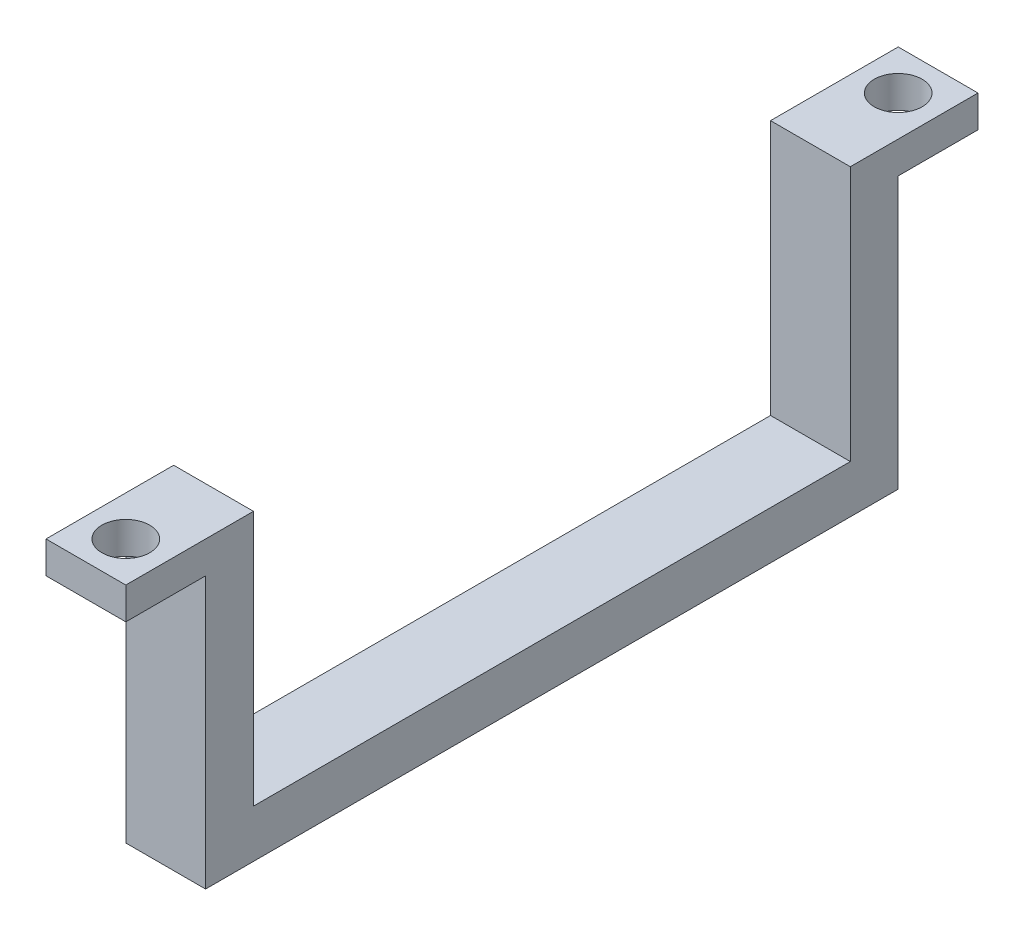
ISO-10303-21;
HEADER;
FILE_DESCRIPTION(('STEP AP214'),'2;1');
FILE_NAME('part.step','',(''),(''),'','','');
FILE_SCHEMA(('AUTOMOTIVE_DESIGN { 1 0 10303 214 1 1 1 1 }'));
ENDSEC;
DATA;
#1=APPLICATION_CONTEXT('core data for automotive mechanical design processes');
#2=APPLICATION_PROTOCOL_DEFINITION('international standard','automotive_design',2000,#1);
#3=PRODUCT_CONTEXT('',#1,'mechanical');
#4=PRODUCT('Part','Part','',(#3));
#5=PRODUCT_RELATED_PRODUCT_CATEGORY('part','',(#4));
#6=PRODUCT_DEFINITION_FORMATION('','',#4);
#7=PRODUCT_DEFINITION_CONTEXT('part definition',#1,'design');
#8=PRODUCT_DEFINITION('design','',#6,#7);
#9=PRODUCT_DEFINITION_SHAPE('','',#8);
#10=(LENGTH_UNIT() NAMED_UNIT(*) SI_UNIT(.MILLI.,.METRE.));
#11=(NAMED_UNIT(*) PLANE_ANGLE_UNIT() SI_UNIT($,.RADIAN.));
#12=(NAMED_UNIT(*) SI_UNIT($,.STERADIAN.) SOLID_ANGLE_UNIT());
#13=UNCERTAINTY_MEASURE_WITH_UNIT(LENGTH_MEASURE(1.E-05),#10,'distance_accuracy_value','');
#14=(GEOMETRIC_REPRESENTATION_CONTEXT(3) GLOBAL_UNCERTAINTY_ASSIGNED_CONTEXT((#13)) GLOBAL_UNIT_ASSIGNED_CONTEXT((#10,
#11,#12)) REPRESENTATION_CONTEXT('',''));
#15=CARTESIAN_POINT('',(0.,0.,0.));
#16=DIRECTION('',(0.,0.,1.));
#17=DIRECTION('',(1.,0.,0.));
#18=AXIS2_PLACEMENT_3D('',#15,#16,#17);
#19=CARTESIAN_POINT('',(0.,2.,0.));
#20=DIRECTION('',(0.,1.,0.));
#21=DIRECTION('',(0.,0.,1.));
#22=AXIS2_PLACEMENT_3D('',#19,#20,#21);
#23=PLANE('',#22);
#24=DIRECTION('',(0.,0.,1.));
#25=VECTOR('',#24,1.);
#26=CARTESIAN_POINT('',(0.,2.,0.));
#27=LINE('',#26,#25);
#28=CARTESIAN_POINT('',(0.,2.,0.));
#29=VERTEX_POINT('',#28);
#30=CARTESIAN_POINT('',(0.,2.,8.));
#31=VERTEX_POINT('',#30);
#32=EDGE_CURVE('E207',#29,#31,#27,.T.);
#33=ORIENTED_EDGE('',*,*,#32,.T.);
#34=DIRECTION('',(1.,0.,0.));
#35=VECTOR('',#34,1.);
#36=CARTESIAN_POINT('',(0.,2.,8.));
#37=LINE('',#36,#35);
#38=CARTESIAN_POINT('',(5.,2.,8.));
#39=VERTEX_POINT('',#38);
#40=EDGE_CURVE('E209',#31,#39,#37,.T.);
#41=ORIENTED_EDGE('',*,*,#40,.T.);
#42=DIRECTION('',(0.,0.,1.));
#43=VECTOR('',#42,1.);
#44=CARTESIAN_POINT('',(5.,2.,0.));
#45=LINE('',#44,#43);
#46=CARTESIAN_POINT('',(5.,2.,0.));
#47=VERTEX_POINT('',#46);
#48=EDGE_CURVE('E213',#47,#39,#45,.T.);
#49=ORIENTED_EDGE('',*,*,#48,.F.);
#50=DIRECTION('',(1.,0.,0.));
#51=VECTOR('',#50,1.);
#52=CARTESIAN_POINT('',(0.,2.,0.));
#53=LINE('',#52,#51);
#54=EDGE_CURVE('E215',#29,#47,#53,.T.);
#55=ORIENTED_EDGE('',*,*,#54,.F.);
#56=EDGE_LOOP('',(#33,#41,#49,#55));
#57=FACE_BOUND('',#56,.T.);
#58=CARTESIAN_POINT('',(2.50000000000001,2.,2.5));
#59=DIRECTION('',(0.,1.,0.));
#60=DIRECTION('',(0.,0.,1.));
#61=AXIS2_PLACEMENT_3D('',#58,#59,#60);
#62=CIRCLE('',#61,1.5);
#63=CARTESIAN_POINT('',(2.50000000000001,2.,4.));
#64=VERTEX_POINT('',#63);
#65=EDGE_CURVE('E201',#64,#64,#62,.T.);
#66=ORIENTED_EDGE('',*,*,#65,.F.);
#67=EDGE_LOOP('',(#66));
#68=FACE_BOUND('',#67,.T.);
#69=ADVANCED_FACE('F65',(#57,#68),#23,.T.);
#70=CARTESIAN_POINT('',(0.,0.,0.));
#71=DIRECTION('',(0.,1.,0.));
#72=DIRECTION('',(0.,0.,1.));
#73=AXIS2_PLACEMENT_3D('',#70,#71,#72);
#74=PLANE('',#73);
#75=DIRECTION('',(0.,0.,1.));
#76=VECTOR('',#75,1.);
#77=CARTESIAN_POINT('',(5.,0.,0.));
#78=LINE('',#77,#76);
#79=CARTESIAN_POINT('',(5.,0.,0.));
#80=VERTEX_POINT('',#79);
#81=CARTESIAN_POINT('',(5.,0.,5.00000000000018));
#82=VERTEX_POINT('',#81);
#83=EDGE_CURVE('E85',#80,#82,#78,.T.);
#84=ORIENTED_EDGE('',*,*,#83,.T.);
#85=DIRECTION('',(-1.,0.,0.));
#86=VECTOR('',#85,1.);
#87=CARTESIAN_POINT('',(0.,0.,5.00000000000018));
#88=LINE('',#87,#86);
#89=CARTESIAN_POINT('',(0.,0.,5.00000000000018));
#90=VERTEX_POINT('',#89);
#91=EDGE_CURVE('E80',#82,#90,#88,.T.);
#92=ORIENTED_EDGE('',*,*,#91,.T.);
#93=DIRECTION('',(0.,0.,1.));
#94=VECTOR('',#93,1.);
#95=CARTESIAN_POINT('',(0.,0.,0.));
#96=LINE('',#95,#94);
#97=CARTESIAN_POINT('',(0.,0.,0.));
#98=VERTEX_POINT('',#97);
#99=EDGE_CURVE('E204',#98,#90,#96,.T.);
#100=ORIENTED_EDGE('',*,*,#99,.F.);
#101=DIRECTION('',(1.,0.,0.));
#102=VECTOR('',#101,1.);
#103=CARTESIAN_POINT('',(0.,0.,0.));
#104=LINE('',#103,#102);
#105=EDGE_CURVE('E210',#98,#80,#104,.T.);
#106=ORIENTED_EDGE('',*,*,#105,.T.);
#107=EDGE_LOOP('',(#84,#92,#100,#106));
#108=FACE_BOUND('',#107,.T.);
#109=CARTESIAN_POINT('',(2.50000000000001,0.,2.5));
#110=DIRECTION('',(0.,1.,0.));
#111=DIRECTION('',(0.,0.,1.));
#112=AXIS2_PLACEMENT_3D('',#109,#110,#111);
#113=CIRCLE('',#112,1.5);
#114=CARTESIAN_POINT('',(2.50000000000001,0.,4.));
#115=VERTEX_POINT('',#114);
#116=EDGE_CURVE('E200',#115,#115,#113,.T.);
#117=ORIENTED_EDGE('',*,*,#116,.T.);
#118=EDGE_LOOP('',(#117));
#119=FACE_BOUND('',#118,.T.);
#120=ADVANCED_FACE('F238',(#108,#119),#74,.F.);
#121=CARTESIAN_POINT('',(0.,2.,0.));
#122=DIRECTION('',(1.,0.,0.));
#123=DIRECTION('',(0.,0.,-1.));
#124=AXIS2_PLACEMENT_3D('',#121,#122,#123);
#125=PLANE('',#124);
#126=ORIENTED_EDGE('',*,*,#99,.T.);
#127=DIRECTION('',(0.,1.,0.));
#128=VECTOR('',#127,1.);
#129=CARTESIAN_POINT('',(0.,-14.,5.00000000000018));
#130=LINE('',#129,#128);
#131=CARTESIAN_POINT('',(0.,-17.,5.00000000000018));
#132=VERTEX_POINT('',#131);
#133=EDGE_CURVE('E196',#132,#90,#130,.T.);
#134=ORIENTED_EDGE('',*,*,#133,.F.);
#135=DIRECTION('',(0.,0.,1.));
#136=VECTOR('',#135,1.);
#137=CARTESIAN_POINT('',(0.,-17.,-0.830951894845125));
#138=LINE('',#137,#136);
#139=CARTESIAN_POINT('',(0.,-17.,48.4));
#140=VERTEX_POINT('',#139);
#141=EDGE_CURVE('E179',#132,#140,#138,.T.);
#142=ORIENTED_EDGE('',*,*,#141,.T.);
#143=DIRECTION('',(0.,-1.,0.));
#144=VECTOR('',#143,1.);
#145=CARTESIAN_POINT('',(0.,-14.,48.4));
#146=LINE('',#145,#144);
#147=CARTESIAN_POINT('',(0.,0.,48.4));
#148=VERTEX_POINT('',#147);
#149=EDGE_CURVE('E185',#148,#140,#146,.T.);
#150=ORIENTED_EDGE('',*,*,#149,.F.);
#151=DIRECTION('',(0.,0.,-1.));
#152=VECTOR('',#151,1.);
#153=CARTESIAN_POINT('',(0.,0.,53.4));
#154=LINE('',#153,#152);
#155=CARTESIAN_POINT('',(0.,0.,53.4));
#156=VERTEX_POINT('',#155);
#157=EDGE_CURVE('E269',#156,#148,#154,.T.);
#158=ORIENTED_EDGE('',*,*,#157,.F.);
#159=DIRECTION('',(0.,-1.,0.));
#160=VECTOR('',#159,1.);
#161=CARTESIAN_POINT('',(0.,2.,53.4));
#162=LINE('',#161,#160);
#163=CARTESIAN_POINT('',(0.,2.,53.4));
#164=VERTEX_POINT('',#163);
#165=EDGE_CURVE('E163',#164,#156,#162,.T.);
#166=ORIENTED_EDGE('',*,*,#165,.F.);
#167=DIRECTION('',(0.,0.,-1.));
#168=VECTOR('',#167,1.);
#169=CARTESIAN_POINT('',(0.,2.,53.4));
#170=LINE('',#169,#168);
#171=CARTESIAN_POINT('',(0.,2.,45.4));
#172=VERTEX_POINT('',#171);
#173=EDGE_CURVE('E159',#164,#172,#170,.T.);
#174=ORIENTED_EDGE('',*,*,#173,.T.);
#175=DIRECTION('',(0.,-1.,0.));
#176=VECTOR('',#175,1.);
#177=CARTESIAN_POINT('',(0.,2.,45.4));
#178=LINE('',#177,#176);
#179=CARTESIAN_POINT('',(0.,-14.,45.4));
#180=VERTEX_POINT('',#179);
#181=EDGE_CURVE('E153',#172,#180,#178,.T.);
#182=ORIENTED_EDGE('',*,*,#181,.T.);
#183=DIRECTION('',(0.,0.,1.));
#184=VECTOR('',#183,1.);
#185=CARTESIAN_POINT('',(0.,-14.,-0.830951894845125));
#186=LINE('',#185,#184);
#187=CARTESIAN_POINT('',(0.,-14.,8.00000000000018));
#188=VERTEX_POINT('',#187);
#189=EDGE_CURVE('E157',#188,#180,#186,.T.);
#190=ORIENTED_EDGE('',*,*,#189,.F.);
#191=DIRECTION('',(0.,-1.,0.));
#192=VECTOR('',#191,1.);
#193=CARTESIAN_POINT('',(0.,2.,8.));
#194=LINE('',#193,#192);
#195=EDGE_CURVE('E12',#31,#188,#194,.T.);
#196=ORIENTED_EDGE('',*,*,#195,.F.);
#197=ORIENTED_EDGE('',*,*,#32,.F.);
#198=DIRECTION('',(0.,-1.,0.));
#199=VECTOR('',#198,1.);
#200=CARTESIAN_POINT('',(0.,2.,0.));
#201=LINE('',#200,#199);
#202=EDGE_CURVE('E218',#29,#98,#201,.T.);
#203=ORIENTED_EDGE('',*,*,#202,.T.);
#204=EDGE_LOOP('',(#126,#134,#142,#150,#158,#166,#174,#182,#190,#196,#197,#203));
#205=FACE_BOUND('',#204,.T.);
#206=ADVANCED_FACE('F67',(#205),#125,.F.);
#207=CARTESIAN_POINT('',(0.,2.,8.));
#208=DIRECTION('',(0.,0.,-1.));
#209=DIRECTION('',(-1.,0.,0.));
#210=AXIS2_PLACEMENT_3D('',#207,#208,#209);
#211=PLANE('',#210);
#212=ORIENTED_EDGE('',*,*,#195,.T.);
#213=DIRECTION('',(-1.,0.,0.));
#214=VECTOR('',#213,1.);
#215=CARTESIAN_POINT('',(0.,-14.,8.00000000000018));
#216=LINE('',#215,#214);
#217=CARTESIAN_POINT('',(5.00000000000001,-14.,8.00000000000018));
#218=VERTEX_POINT('',#217);
#219=EDGE_CURVE('E178',#218,#188,#216,.T.);
#220=ORIENTED_EDGE('',*,*,#219,.F.);
#221=DIRECTION('',(0.,-1.,0.));
#222=VECTOR('',#221,1.);
#223=CARTESIAN_POINT('',(5.,2.,8.));
#224=LINE('',#223,#222);
#225=EDGE_CURVE('E73',#39,#218,#224,.T.);
#226=ORIENTED_EDGE('',*,*,#225,.F.);
#227=ORIENTED_EDGE('',*,*,#40,.F.);
#228=EDGE_LOOP('',(#212,#220,#226,#227));
#229=FACE_BOUND('',#228,.T.);
#230=ADVANCED_FACE('F230',(#229),#211,.F.);
#231=CARTESIAN_POINT('',(5.,2.,0.));
#232=DIRECTION('',(1.,0.,0.));
#233=DIRECTION('',(0.,0.,-1.));
#234=AXIS2_PLACEMENT_3D('',#231,#232,#233);
#235=PLANE('',#234);
#236=ORIENTED_EDGE('',*,*,#48,.T.);
#237=ORIENTED_EDGE('',*,*,#225,.T.);
#238=DIRECTION('',(0.,0.,1.));
#239=VECTOR('',#238,1.);
#240=CARTESIAN_POINT('',(5.00000000000002,-14.,-0.830951894845125));
#241=LINE('',#240,#239);
#242=CARTESIAN_POINT('',(5.00000000000001,-14.,45.4));
#243=VERTEX_POINT('',#242);
#244=EDGE_CURVE('E189',#218,#243,#241,.T.);
#245=ORIENTED_EDGE('',*,*,#244,.T.);
#246=DIRECTION('',(0.,-1.,0.));
#247=VECTOR('',#246,1.);
#248=CARTESIAN_POINT('',(5.00000000000001,2.,45.4));
#249=LINE('',#248,#247);
#250=CARTESIAN_POINT('',(5.00000000000001,2.,45.4));
#251=VERTEX_POINT('',#250);
#252=EDGE_CURVE('E164',#251,#243,#249,.T.);
#253=ORIENTED_EDGE('',*,*,#252,.F.);
#254=DIRECTION('',(0.,0.,-1.));
#255=VECTOR('',#254,1.);
#256=CARTESIAN_POINT('',(5.00000000000001,2.,53.4));
#257=LINE('',#256,#255);
#258=CARTESIAN_POINT('',(5.00000000000001,2.,53.4));
#259=VERTEX_POINT('',#258);
#260=EDGE_CURVE('E286',#259,#251,#257,.T.);
#261=ORIENTED_EDGE('',*,*,#260,.F.);
#262=DIRECTION('',(0.,-1.,0.));
#263=VECTOR('',#262,1.);
#264=CARTESIAN_POINT('',(5.00000000000001,2.,53.4));
#265=LINE('',#264,#263);
#266=CARTESIAN_POINT('',(5.00000000000001,0.,53.4));
#267=VERTEX_POINT('',#266);
#268=EDGE_CURVE('E270',#259,#267,#265,.T.);
#269=ORIENTED_EDGE('',*,*,#268,.T.);
#270=DIRECTION('',(0.,0.,-1.));
#271=VECTOR('',#270,1.);
#272=CARTESIAN_POINT('',(5.00000000000001,0.,53.4));
#273=LINE('',#272,#271);
#274=CARTESIAN_POINT('',(5.00000000000001,0.,48.4));
#275=VERTEX_POINT('',#274);
#276=EDGE_CURVE('E265',#267,#275,#273,.T.);
#277=ORIENTED_EDGE('',*,*,#276,.T.);
#278=DIRECTION('',(0.,1.,0.));
#279=VECTOR('',#278,1.);
#280=CARTESIAN_POINT('',(5.00000000000002,-14.,48.4));
#281=LINE('',#280,#279);
#282=CARTESIAN_POINT('',(5.00000000000002,-17.,48.4));
#283=VERTEX_POINT('',#282);
#284=EDGE_CURVE('E257',#283,#275,#281,.T.);
#285=ORIENTED_EDGE('',*,*,#284,.F.);
#286=DIRECTION('',(0.,0.,1.));
#287=VECTOR('',#286,1.);
#288=CARTESIAN_POINT('',(5.00000000000002,-17.,-0.830951894845125));
#289=LINE('',#288,#287);
#290=CARTESIAN_POINT('',(5.00000000000002,-17.,5.00000000000018));
#291=VERTEX_POINT('',#290);
#292=EDGE_CURVE('E191',#291,#283,#289,.T.);
#293=ORIENTED_EDGE('',*,*,#292,.F.);
#294=DIRECTION('',(0.,1.,0.));
#295=VECTOR('',#294,1.);
#296=CARTESIAN_POINT('',(5.00000000000001,-14.,5.00000000000018));
#297=LINE('',#296,#295);
#298=EDGE_CURVE('E193',#291,#82,#297,.T.);
#299=ORIENTED_EDGE('',*,*,#298,.T.);
#300=ORIENTED_EDGE('',*,*,#83,.F.);
#301=DIRECTION('',(0.,-1.,0.));
#302=VECTOR('',#301,1.);
#303=CARTESIAN_POINT('',(5.,2.,0.));
#304=LINE('',#303,#302);
#305=EDGE_CURVE('E223',#47,#80,#304,.T.);
#306=ORIENTED_EDGE('',*,*,#305,.F.);
#307=EDGE_LOOP('',(#236,#237,#245,#253,#261,#269,#277,#285,#293,#299,#300,#306));
#308=FACE_BOUND('',#307,.T.);
#309=ADVANCED_FACE('F226',(#308),#235,.T.);
#310=CARTESIAN_POINT('',(0.,2.,0.));
#311=DIRECTION('',(0.,0.,-1.));
#312=DIRECTION('',(-1.,0.,0.));
#313=AXIS2_PLACEMENT_3D('',#310,#311,#312);
#314=PLANE('',#313);
#315=ORIENTED_EDGE('',*,*,#105,.F.);
#316=ORIENTED_EDGE('',*,*,#202,.F.);
#317=ORIENTED_EDGE('',*,*,#54,.T.);
#318=ORIENTED_EDGE('',*,*,#305,.T.);
#319=EDGE_LOOP('',(#315,#316,#317,#318));
#320=FACE_BOUND('',#319,.T.);
#321=ADVANCED_FACE('F237',(#320),#314,.T.);
#322=CARTESIAN_POINT('',(2.50000000000001,2.,2.5));
#323=DIRECTION('',(0.,-1.,0.));
#324=DIRECTION('',(0.,0.,-1.));
#325=AXIS2_PLACEMENT_3D('',#322,#323,#324);
#326=CYLINDRICAL_SURFACE('',#325,1.5);
#327=ORIENTED_EDGE('',*,*,#65,.T.);
#328=EDGE_LOOP('',(#327));
#329=FACE_BOUND('',#328,.T.);
#330=ORIENTED_EDGE('',*,*,#116,.F.);
#331=EDGE_LOOP('',(#330));
#332=FACE_BOUND('',#331,.T.);
#333=ADVANCED_FACE('F318',(#329,#332),#326,.F.);
#334=CARTESIAN_POINT('',(0.,-14.,5.00000000000018));
#335=DIRECTION('',(0.,0.,-1.));
#336=DIRECTION('',(-1.,0.,0.));
#337=AXIS2_PLACEMENT_3D('',#334,#335,#336);
#338=PLANE('',#337);
#339=ORIENTED_EDGE('',*,*,#91,.F.);
#340=ORIENTED_EDGE('',*,*,#298,.F.);
#341=DIRECTION('',(1.,0.,0.));
#342=VECTOR('',#341,1.);
#343=CARTESIAN_POINT('',(5.00000000000002,-17.,5.00000000000018));
#344=LINE('',#343,#342);
#345=EDGE_CURVE('E182',#132,#291,#344,.T.);
#346=ORIENTED_EDGE('',*,*,#345,.F.);
#347=ORIENTED_EDGE('',*,*,#133,.T.);
#348=EDGE_LOOP('',(#339,#340,#346,#347));
#349=FACE_BOUND('',#348,.T.);
#350=ADVANCED_FACE('F242',(#349),#338,.T.);
#351=CARTESIAN_POINT('',(0.,0.,48.4));
#352=DIRECTION('',(0.,0.,-1.));
#353=DIRECTION('',(-1.,0.,0.));
#354=AXIS2_PLACEMENT_3D('',#351,#352,#353);
#355=PLANE('',#354);
#356=ORIENTED_EDGE('',*,*,#284,.T.);
#357=DIRECTION('',(-1.,0.,0.));
#358=VECTOR('',#357,1.);
#359=CARTESIAN_POINT('',(0.,0.,48.4));
#360=LINE('',#359,#358);
#361=EDGE_CURVE('E173',#275,#148,#360,.T.);
#362=ORIENTED_EDGE('',*,*,#361,.T.);
#363=ORIENTED_EDGE('',*,*,#149,.T.);
#364=DIRECTION('',(1.,0.,0.));
#365=VECTOR('',#364,1.);
#366=CARTESIAN_POINT('',(5.00000000000002,-17.,48.4));
#367=LINE('',#366,#365);
#368=EDGE_CURVE('E180',#140,#283,#367,.T.);
#369=ORIENTED_EDGE('',*,*,#368,.T.);
#370=EDGE_LOOP('',(#356,#362,#363,#369));
#371=FACE_BOUND('',#370,.T.);
#372=ADVANCED_FACE('F255',(#371),#355,.F.);
#373=CARTESIAN_POINT('',(5.00000000000002,-14.,-0.830951894845125));
#374=DIRECTION('',(0.,1.,0.));
#375=DIRECTION('',(0.,0.,1.));
#376=AXIS2_PLACEMENT_3D('',#373,#374,#375);
#377=PLANE('',#376);
#378=DIRECTION('',(-1.,0.,0.));
#379=VECTOR('',#378,1.);
#380=CARTESIAN_POINT('',(0.,-14.,45.4));
#381=LINE('',#380,#379);
#382=EDGE_CURVE('E167',#243,#180,#381,.T.);
#383=ORIENTED_EDGE('',*,*,#382,.F.);
#384=ORIENTED_EDGE('',*,*,#244,.F.);
#385=ORIENTED_EDGE('',*,*,#219,.T.);
#386=ORIENTED_EDGE('',*,*,#189,.T.);
#387=EDGE_LOOP('',(#383,#384,#385,#386));
#388=FACE_BOUND('',#387,.T.);
#389=ADVANCED_FACE('F176',(#388),#377,.T.);
#390=CARTESIAN_POINT('',(5.00000000000002,-17.,-0.830951894845125));
#391=DIRECTION('',(0.,-1.,0.));
#392=DIRECTION('',(0.,0.,-1.));
#393=AXIS2_PLACEMENT_3D('',#390,#391,#392);
#394=PLANE('',#393);
#395=ORIENTED_EDGE('',*,*,#141,.F.);
#396=ORIENTED_EDGE('',*,*,#345,.T.);
#397=ORIENTED_EDGE('',*,*,#292,.T.);
#398=ORIENTED_EDGE('',*,*,#368,.F.);
#399=EDGE_LOOP('',(#395,#396,#397,#398));
#400=FACE_BOUND('',#399,.T.);
#401=ADVANCED_FACE('F249',(#400),#394,.T.);
#402=CARTESIAN_POINT('',(0.,0.,0.));
#403=DIRECTION('',(0.,1.,0.));
#404=DIRECTION('',(0.,0.,1.));
#405=AXIS2_PLACEMENT_3D('',#402,#403,#404);
#406=PLANE('',#405);
#407=CARTESIAN_POINT('',(2.50000000000001,0.,50.9));
#408=DIRECTION('',(0.,1.,0.));
#409=DIRECTION('',(0.,0.,1.));
#410=AXIS2_PLACEMENT_3D('',#407,#408,#409);
#411=CIRCLE('',#410,1.5);
#412=CARTESIAN_POINT('',(2.50000000000001,0.,52.4));
#413=VERTEX_POINT('',#412);
#414=EDGE_CURVE('E259',#413,#413,#411,.T.);
#415=ORIENTED_EDGE('',*,*,#414,.T.);
#416=EDGE_LOOP('',(#415));
#417=FACE_BOUND('',#416,.T.);
#418=ORIENTED_EDGE('',*,*,#361,.F.);
#419=ORIENTED_EDGE('',*,*,#276,.F.);
#420=DIRECTION('',(1.,0.,0.));
#421=VECTOR('',#420,1.);
#422=CARTESIAN_POINT('',(0.,0.,53.4));
#423=LINE('',#422,#421);
#424=EDGE_CURVE('E279',#156,#267,#423,.T.);
#425=ORIENTED_EDGE('',*,*,#424,.F.);
#426=ORIENTED_EDGE('',*,*,#157,.T.);
#427=EDGE_LOOP('',(#418,#419,#425,#426));
#428=FACE_BOUND('',#427,.T.);
#429=ADVANCED_FACE('F267',(#417,#428),#406,.F.);
#430=CARTESIAN_POINT('',(0.,2.,0.));
#431=DIRECTION('',(0.,1.,0.));
#432=DIRECTION('',(0.,0.,1.));
#433=AXIS2_PLACEMENT_3D('',#430,#431,#432);
#434=PLANE('',#433);
#435=DIRECTION('',(1.,0.,0.));
#436=VECTOR('',#435,1.);
#437=CARTESIAN_POINT('',(0.,2.,45.4));
#438=LINE('',#437,#436);
#439=EDGE_CURVE('E284',#172,#251,#438,.T.);
#440=ORIENTED_EDGE('',*,*,#439,.F.);
#441=ORIENTED_EDGE('',*,*,#173,.F.);
#442=DIRECTION('',(1.,0.,0.));
#443=VECTOR('',#442,1.);
#444=CARTESIAN_POINT('',(0.,2.,53.4));
#445=LINE('',#444,#443);
#446=EDGE_CURVE('E277',#164,#259,#445,.T.);
#447=ORIENTED_EDGE('',*,*,#446,.T.);
#448=ORIENTED_EDGE('',*,*,#260,.T.);
#449=EDGE_LOOP('',(#440,#441,#447,#448));
#450=FACE_BOUND('',#449,.T.);
#451=CARTESIAN_POINT('',(2.50000000000001,2.,50.9));
#452=DIRECTION('',(0.,1.,0.));
#453=DIRECTION('',(0.,0.,1.));
#454=AXIS2_PLACEMENT_3D('',#451,#452,#453);
#455=CIRCLE('',#454,1.5);
#456=CARTESIAN_POINT('',(2.50000000000001,2.,52.4));
#457=VERTEX_POINT('',#456);
#458=EDGE_CURVE('E282',#457,#457,#455,.T.);
#459=ORIENTED_EDGE('',*,*,#458,.F.);
#460=EDGE_LOOP('',(#459));
#461=FACE_BOUND('',#460,.T.);
#462=ADVANCED_FACE('F297',(#450,#461),#434,.T.);
#463=CARTESIAN_POINT('',(0.,2.,53.4));
#464=DIRECTION('',(0.,0.,-1.));
#465=DIRECTION('',(-1.,0.,0.));
#466=AXIS2_PLACEMENT_3D('',#463,#464,#465);
#467=PLANE('',#466);
#468=ORIENTED_EDGE('',*,*,#424,.T.);
#469=ORIENTED_EDGE('',*,*,#268,.F.);
#470=ORIENTED_EDGE('',*,*,#446,.F.);
#471=ORIENTED_EDGE('',*,*,#165,.T.);
#472=EDGE_LOOP('',(#468,#469,#470,#471));
#473=FACE_BOUND('',#472,.T.);
#474=ADVANCED_FACE('F299',(#473),#467,.F.);
#475=CARTESIAN_POINT('',(0.,2.,45.4));
#476=DIRECTION('',(0.,0.,-1.));
#477=DIRECTION('',(-1.,0.,0.));
#478=AXIS2_PLACEMENT_3D('',#475,#476,#477);
#479=PLANE('',#478);
#480=ORIENTED_EDGE('',*,*,#252,.T.);
#481=ORIENTED_EDGE('',*,*,#382,.T.);
#482=ORIENTED_EDGE('',*,*,#181,.F.);
#483=ORIENTED_EDGE('',*,*,#439,.T.);
#484=EDGE_LOOP('',(#480,#481,#482,#483));
#485=FACE_BOUND('',#484,.T.);
#486=ADVANCED_FACE('F168',(#485),#479,.T.);
#487=CARTESIAN_POINT('',(2.50000000000001,2.,50.9));
#488=DIRECTION('',(0.,-1.,0.));
#489=DIRECTION('',(0.,0.,-1.));
#490=AXIS2_PLACEMENT_3D('',#487,#488,#489);
#491=CYLINDRICAL_SURFACE('',#490,1.5);
#492=ORIENTED_EDGE('',*,*,#458,.T.);
#493=EDGE_LOOP('',(#492));
#494=FACE_BOUND('',#493,.T.);
#495=ORIENTED_EDGE('',*,*,#414,.F.);
#496=EDGE_LOOP('',(#495));
#497=FACE_BOUND('',#496,.T.);
#498=ADVANCED_FACE('F294',(#494,#497),#491,.F.);
#499=CLOSED_SHELL('',(#69,#120,#206,#230,#309,#321,#333,#350,#372,#389,#401,#429,#462,#474,#486,#498));
#500=MANIFOLD_SOLID_BREP('B2',#499);
#501=ADVANCED_BREP_SHAPE_REPRESENTATION('',(#18,#500),#14);
#502=SHAPE_DEFINITION_REPRESENTATION(#9,#501);
ENDSEC;
END-ISO-10303-21;
